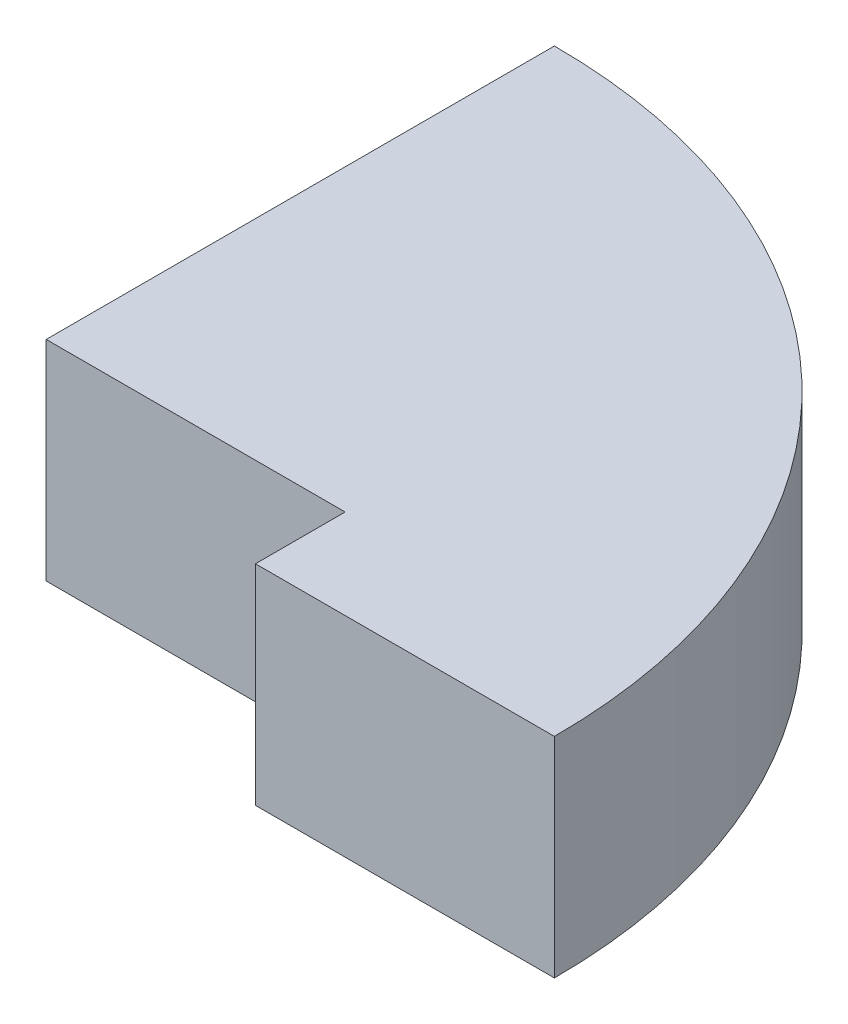
ISO-10303-21;
HEADER;
FILE_DESCRIPTION(('STEP AP214'),'2;1');
FILE_NAME('part.step','',(''),(''),'','','');
FILE_SCHEMA(('AUTOMOTIVE_DESIGN { 1 0 10303 214 1 1 1 1 }'));
ENDSEC;
DATA;
#1=APPLICATION_CONTEXT('core data for automotive mechanical design processes');
#2=APPLICATION_PROTOCOL_DEFINITION('international standard','automotive_design',2000,#1);
#3=PRODUCT_CONTEXT('',#1,'mechanical');
#4=PRODUCT('Part','Part','',(#3));
#5=PRODUCT_RELATED_PRODUCT_CATEGORY('part','',(#4));
#6=PRODUCT_DEFINITION_FORMATION('','',#4);
#7=PRODUCT_DEFINITION_CONTEXT('part definition',#1,'design');
#8=PRODUCT_DEFINITION('design','',#6,#7);
#9=PRODUCT_DEFINITION_SHAPE('','',#8);
#10=(LENGTH_UNIT() NAMED_UNIT(*) SI_UNIT(.MILLI.,.METRE.));
#11=(NAMED_UNIT(*) PLANE_ANGLE_UNIT() SI_UNIT($,.RADIAN.));
#12=(NAMED_UNIT(*) SI_UNIT($,.STERADIAN.) SOLID_ANGLE_UNIT());
#13=UNCERTAINTY_MEASURE_WITH_UNIT(LENGTH_MEASURE(1.E-05),#10,'distance_accuracy_value','');
#14=(GEOMETRIC_REPRESENTATION_CONTEXT(3) GLOBAL_UNCERTAINTY_ASSIGNED_CONTEXT((#13)) GLOBAL_UNIT_ASSIGNED_CONTEXT((#10,
#11,#12)) REPRESENTATION_CONTEXT('',''));
#15=CARTESIAN_POINT('',(0.,0.,0.));
#16=DIRECTION('',(0.,0.,1.));
#17=DIRECTION('',(1.,0.,0.));
#18=AXIS2_PLACEMENT_3D('',#15,#16,#17);
#19=CARTESIAN_POINT('',(0.,22.225,0.));
#20=DIRECTION('',(0.,0.,-1.));
#21=DIRECTION('',(-1.,0.,0.));
#22=AXIS2_PLACEMENT_3D('',#19,#20,#21);
#23=PLANE('',#22);
#24=DIRECTION('',(1.,0.,0.));
#25=VECTOR('',#24,1.);
#26=CARTESIAN_POINT('',(0.,0.,0.));
#27=LINE('',#26,#25);
#28=CARTESIAN_POINT('',(31.75,0.,0.));
#29=VERTEX_POINT('',#28);
#30=CARTESIAN_POINT('',(63.5,0.,0.));
#31=VERTEX_POINT('',#30);
#32=EDGE_CURVE('E106',#29,#31,#27,.T.);
#33=ORIENTED_EDGE('',*,*,#32,.T.);
#34=DIRECTION('',(0.,-1.,0.));
#35=VECTOR('',#34,1.);
#36=CARTESIAN_POINT('',(63.5000000000003,22.225,0.));
#37=LINE('',#36,#35);
#38=CARTESIAN_POINT('',(63.5000000000003,22.225,0.));
#39=VERTEX_POINT('',#38);
#40=EDGE_CURVE('E11',#39,#31,#37,.T.);
#41=ORIENTED_EDGE('',*,*,#40,.F.);
#42=DIRECTION('',(1.,0.,0.));
#43=VECTOR('',#42,1.);
#44=CARTESIAN_POINT('',(0.,22.225,0.));
#45=LINE('',#44,#43);
#46=CARTESIAN_POINT('',(31.75,22.225,0.));
#47=VERTEX_POINT('',#46);
#48=EDGE_CURVE('E101',#47,#39,#45,.T.);
#49=ORIENTED_EDGE('',*,*,#48,.F.);
#50=DIRECTION('',(0.,-1.,0.));
#51=VECTOR('',#50,1.);
#52=CARTESIAN_POINT('',(31.75,22.225,0.));
#53=LINE('',#52,#51);
#54=EDGE_CURVE('E46',#47,#29,#53,.T.);
#55=ORIENTED_EDGE('',*,*,#54,.T.);
#56=EDGE_LOOP('',(#33,#41,#49,#55));
#57=FACE_BOUND('',#56,.T.);
#58=ADVANCED_FACE('F30',(#57),#23,.F.);
#59=CARTESIAN_POINT('',(0.,22.225,0.));
#60=DIRECTION('',(0.,-1.,0.));
#61=DIRECTION('',(0.,0.,-1.));
#62=AXIS2_PLACEMENT_3D('',#59,#60,#61);
#63=CYLINDRICAL_SURFACE('',#62,63.5);
#64=CARTESIAN_POINT('',(0.,0.,0.));
#65=DIRECTION('',(0.,1.,0.));
#66=DIRECTION('',(0.,0.,1.));
#67=AXIS2_PLACEMENT_3D('',#64,#65,#66);
#68=CIRCLE('',#67,63.5);
#69=CARTESIAN_POINT('',(0.,0.,-63.5));
#70=VERTEX_POINT('',#69);
#71=EDGE_CURVE('E108',#31,#70,#68,.T.);
#72=ORIENTED_EDGE('',*,*,#71,.T.);
#73=DIRECTION('',(0.,-1.,0.));
#74=VECTOR('',#73,1.);
#75=CARTESIAN_POINT('',(0.,22.225,-63.5));
#76=LINE('',#75,#74);
#77=CARTESIAN_POINT('',(0.,22.225,-63.5));
#78=VERTEX_POINT('',#77);
#79=EDGE_CURVE('E38',#78,#70,#76,.T.);
#80=ORIENTED_EDGE('',*,*,#79,.F.);
#81=CARTESIAN_POINT('',(0.,22.225,0.));
#82=DIRECTION('',(0.,1.,0.));
#83=DIRECTION('',(0.,0.,1.));
#84=AXIS2_PLACEMENT_3D('',#81,#82,#83);
#85=CIRCLE('',#84,63.5);
#86=EDGE_CURVE('E76',#39,#78,#85,.T.);
#87=ORIENTED_EDGE('',*,*,#86,.F.);
#88=ORIENTED_EDGE('',*,*,#40,.T.);
#89=EDGE_LOOP('',(#72,#80,#87,#88));
#90=FACE_BOUND('',#89,.T.);
#91=ADVANCED_FACE('F118',(#90),#63,.T.);
#92=CARTESIAN_POINT('',(0.,22.225,0.));
#93=DIRECTION('',(-1.,0.,0.));
#94=DIRECTION('',(0.,0.,1.));
#95=AXIS2_PLACEMENT_3D('',#92,#93,#94);
#96=PLANE('',#95);
#97=DIRECTION('',(0.,0.,-1.));
#98=VECTOR('',#97,1.);
#99=CARTESIAN_POINT('',(0.,0.,0.));
#100=LINE('',#99,#98);
#101=CARTESIAN_POINT('',(0.,0.,-9.525));
#102=VERTEX_POINT('',#101);
#103=EDGE_CURVE('E89',#102,#70,#100,.T.);
#104=ORIENTED_EDGE('',*,*,#103,.F.);
#105=DIRECTION('',(0.,-1.,0.));
#106=VECTOR('',#105,1.);
#107=CARTESIAN_POINT('',(0.,22.225,-9.525));
#108=LINE('',#107,#106);
#109=CARTESIAN_POINT('',(0.,22.225,-9.525));
#110=VERTEX_POINT('',#109);
#111=EDGE_CURVE('E83',#110,#102,#108,.T.);
#112=ORIENTED_EDGE('',*,*,#111,.F.);
#113=DIRECTION('',(0.,0.,-1.));
#114=VECTOR('',#113,1.);
#115=CARTESIAN_POINT('',(0.,22.225,0.));
#116=LINE('',#115,#114);
#117=EDGE_CURVE('E87',#110,#78,#116,.T.);
#118=ORIENTED_EDGE('',*,*,#117,.T.);
#119=ORIENTED_EDGE('',*,*,#79,.T.);
#120=EDGE_LOOP('',(#104,#112,#118,#119));
#121=FACE_BOUND('',#120,.T.);
#122=ADVANCED_FACE('F85',(#121),#96,.T.);
#123=CARTESIAN_POINT('',(0.,22.225,-9.525));
#124=DIRECTION('',(0.,0.,-1.));
#125=DIRECTION('',(-1.,0.,0.));
#126=AXIS2_PLACEMENT_3D('',#123,#124,#125);
#127=PLANE('',#126);
#128=DIRECTION('',(1.,0.,0.));
#129=VECTOR('',#128,1.);
#130=CARTESIAN_POINT('',(0.,0.,-9.525));
#131=LINE('',#130,#129);
#132=CARTESIAN_POINT('',(31.75,0.,-9.525));
#133=VERTEX_POINT('',#132);
#134=EDGE_CURVE('E112',#102,#133,#131,.T.);
#135=ORIENTED_EDGE('',*,*,#134,.T.);
#136=DIRECTION('',(0.,-1.,0.));
#137=VECTOR('',#136,1.);
#138=CARTESIAN_POINT('',(31.75,22.225,-9.525));
#139=LINE('',#138,#137);
#140=CARTESIAN_POINT('',(31.75,22.225,-9.525));
#141=VERTEX_POINT('',#140);
#142=EDGE_CURVE('E64',#141,#133,#139,.T.);
#143=ORIENTED_EDGE('',*,*,#142,.F.);
#144=DIRECTION('',(1.,0.,0.));
#145=VECTOR('',#144,1.);
#146=CARTESIAN_POINT('',(0.,22.225,-9.525));
#147=LINE('',#146,#145);
#148=EDGE_CURVE('E93',#110,#141,#147,.T.);
#149=ORIENTED_EDGE('',*,*,#148,.F.);
#150=ORIENTED_EDGE('',*,*,#111,.T.);
#151=EDGE_LOOP('',(#135,#143,#149,#150));
#152=FACE_BOUND('',#151,.T.);
#153=ADVANCED_FACE('F94',(#152),#127,.F.);
#154=CARTESIAN_POINT('',(31.75,22.225,0.));
#155=DIRECTION('',(-1.,0.,0.));
#156=DIRECTION('',(0.,0.,1.));
#157=AXIS2_PLACEMENT_3D('',#154,#155,#156);
#158=PLANE('',#157);
#159=DIRECTION('',(0.,0.,-1.));
#160=VECTOR('',#159,1.);
#161=CARTESIAN_POINT('',(31.75,0.,0.));
#162=LINE('',#161,#160);
#163=EDGE_CURVE('E114',#29,#133,#162,.T.);
#164=ORIENTED_EDGE('',*,*,#163,.F.);
#165=ORIENTED_EDGE('',*,*,#54,.F.);
#166=DIRECTION('',(0.,0.,-1.));
#167=VECTOR('',#166,1.);
#168=CARTESIAN_POINT('',(31.75,22.225,0.));
#169=LINE('',#168,#167);
#170=EDGE_CURVE('E97',#47,#141,#169,.T.);
#171=ORIENTED_EDGE('',*,*,#170,.T.);
#172=ORIENTED_EDGE('',*,*,#142,.T.);
#173=EDGE_LOOP('',(#164,#165,#171,#172));
#174=FACE_BOUND('',#173,.T.);
#175=ADVANCED_FACE('F122',(#174),#158,.T.);
#176=CARTESIAN_POINT('',(0.,22.225,0.));
#177=DIRECTION('',(0.,1.,0.));
#178=DIRECTION('',(0.,0.,1.));
#179=AXIS2_PLACEMENT_3D('',#176,#177,#178);
#180=PLANE('',#179);
#181=ORIENTED_EDGE('',*,*,#48,.T.);
#182=ORIENTED_EDGE('',*,*,#86,.T.);
#183=ORIENTED_EDGE('',*,*,#117,.F.);
#184=ORIENTED_EDGE('',*,*,#148,.T.);
#185=ORIENTED_EDGE('',*,*,#170,.F.);
#186=EDGE_LOOP('',(#181,#182,#183,#184,#185));
#187=FACE_BOUND('',#186,.T.);
#188=ADVANCED_FACE('F99',(#187),#180,.T.);
#189=CARTESIAN_POINT('',(0.,0.,0.));
#190=DIRECTION('',(0.,1.,0.));
#191=DIRECTION('',(0.,0.,1.));
#192=AXIS2_PLACEMENT_3D('',#189,#190,#191);
#193=PLANE('',#192);
#194=ORIENTED_EDGE('',*,*,#32,.F.);
#195=ORIENTED_EDGE('',*,*,#163,.T.);
#196=ORIENTED_EDGE('',*,*,#134,.F.);
#197=ORIENTED_EDGE('',*,*,#103,.T.);
#198=ORIENTED_EDGE('',*,*,#71,.F.);
#199=EDGE_LOOP('',(#194,#195,#196,#197,#198));
#200=FACE_BOUND('',#199,.T.);
#201=ADVANCED_FACE('F121',(#200),#193,.F.);
#202=CLOSED_SHELL('',(#58,#91,#122,#153,#175,#188,#201));
#203=MANIFOLD_SOLID_BREP('B2',#202);
#204=ADVANCED_BREP_SHAPE_REPRESENTATION('',(#18,#203),#14);
#205=SHAPE_DEFINITION_REPRESENTATION(#9,#204);
ENDSEC;
END-ISO-10303-21;
